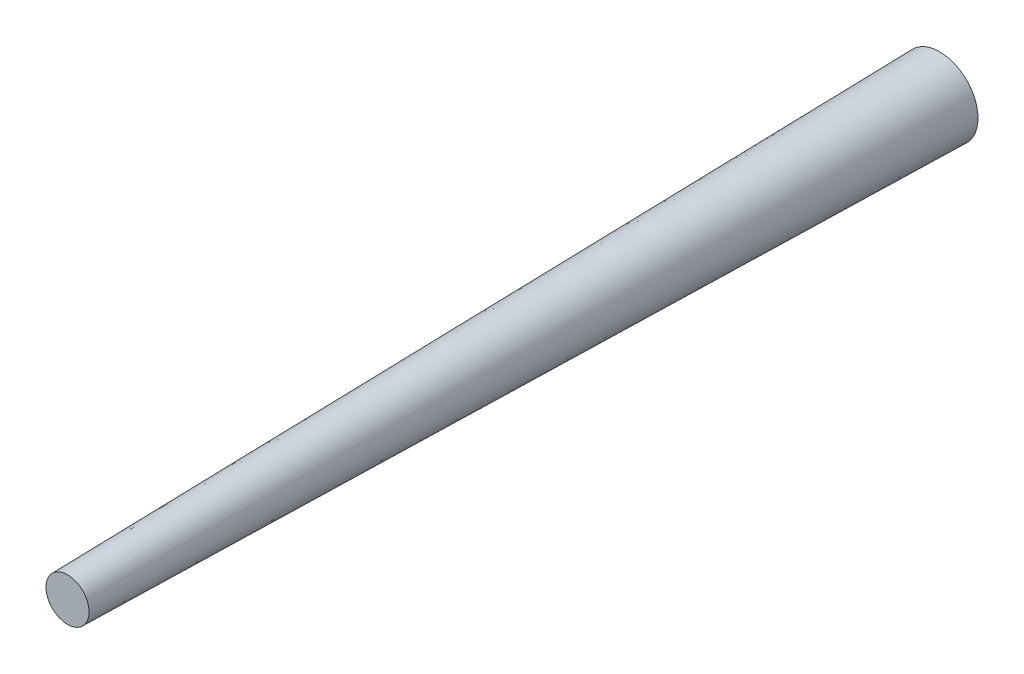
ISO-10303-21;
HEADER;
FILE_DESCRIPTION(('STEP AP214'),'2;1');
FILE_NAME('part.step','',(''),(''),'','','');
FILE_SCHEMA(('AUTOMOTIVE_DESIGN { 1 0 10303 214 1 1 1 1 }'));
ENDSEC;
DATA;
#1=APPLICATION_CONTEXT('core data for automotive mechanical design processes');
#2=APPLICATION_PROTOCOL_DEFINITION('international standard','automotive_design',2000,#1);
#3=PRODUCT_CONTEXT('',#1,'mechanical');
#4=PRODUCT('Part','Part','',(#3));
#5=PRODUCT_RELATED_PRODUCT_CATEGORY('part','',(#4));
#6=PRODUCT_DEFINITION_FORMATION('','',#4);
#7=PRODUCT_DEFINITION_CONTEXT('part definition',#1,'design');
#8=PRODUCT_DEFINITION('design','',#6,#7);
#9=PRODUCT_DEFINITION_SHAPE('','',#8);
#10=(LENGTH_UNIT() NAMED_UNIT(*) SI_UNIT(.MILLI.,.METRE.));
#11=(NAMED_UNIT(*) PLANE_ANGLE_UNIT() SI_UNIT($,.RADIAN.));
#12=(NAMED_UNIT(*) SI_UNIT($,.STERADIAN.) SOLID_ANGLE_UNIT());
#13=UNCERTAINTY_MEASURE_WITH_UNIT(LENGTH_MEASURE(1.E-05),#10,'distance_accuracy_value','');
#14=(GEOMETRIC_REPRESENTATION_CONTEXT(3) GLOBAL_UNCERTAINTY_ASSIGNED_CONTEXT((#13)) GLOBAL_UNIT_ASSIGNED_CONTEXT((#10,
#11,#12)) REPRESENTATION_CONTEXT('',''));
#15=CARTESIAN_POINT('',(0.,0.,0.));
#16=DIRECTION('',(0.,0.,1.));
#17=DIRECTION('',(1.,0.,0.));
#18=AXIS2_PLACEMENT_3D('',#15,#16,#17);
#19=CARTESIAN_POINT('',(0.,0.,1024.69227611953));
#20=DIRECTION('',(0.,0.,-1.));
#21=DIRECTION('',(-1.,0.,0.));
#22=AXIS2_PLACEMENT_3D('',#19,#20,#21);
#23=CONICAL_SURFACE('',#22,15.19139674175,0.0191986217719376);
#24=CARTESIAN_POINT('',(0.,0.,409.692276119534));
#25=DIRECTION('',(0.,0.,1.));
#26=DIRECTION('',(1.,0.,0.));
#27=AXIS2_PLACEMENT_3D('',#24,#25,#26);
#28=CIRCLE('',#27,27.);
#29=CARTESIAN_POINT('',(27.,0.,409.692276119534));
#30=VERTEX_POINT('',#29);
#31=EDGE_CURVE('E10',#30,#30,#28,.T.);
#32=ORIENTED_EDGE('',*,*,#31,.T.);
#33=EDGE_LOOP('',(#32));
#34=FACE_BOUND('',#33,.T.);
#35=CARTESIAN_POINT('',(0.,0.,1024.69227611953));
#36=DIRECTION('',(0.,0.,1.));
#37=DIRECTION('',(1.,0.,0.));
#38=AXIS2_PLACEMENT_3D('',#35,#36,#37);
#39=CIRCLE('',#38,15.19139674175);
#40=CARTESIAN_POINT('',(15.19139674175,0.,1024.69227611953));
#41=VERTEX_POINT('',#40);
#42=EDGE_CURVE('E34',#41,#41,#39,.T.);
#43=ORIENTED_EDGE('',*,*,#42,.F.);
#44=EDGE_LOOP('',(#43));
#45=FACE_BOUND('',#44,.T.);
#46=ADVANCED_FACE('F28',(#34,#45),#23,.T.);
#47=CARTESIAN_POINT('',(27.,0.,409.692276119534));
#48=DIRECTION('',(0.,0.,-1.));
#49=DIRECTION('',(-1.,0.,0.));
#50=AXIS2_PLACEMENT_3D('',#47,#48,#49);
#51=PLANE('',#50);
#52=ORIENTED_EDGE('',*,*,#31,.F.);
#53=EDGE_LOOP('',(#52));
#54=FACE_BOUND('',#53,.T.);
#55=ADVANCED_FACE('F43',(#54),#51,.T.);
#56=CARTESIAN_POINT('',(0.,0.,1024.69227611953));
#57=DIRECTION('',(0.,0.,1.));
#58=DIRECTION('',(1.,0.,0.));
#59=AXIS2_PLACEMENT_3D('',#56,#57,#58);
#60=PLANE('',#59);
#61=ORIENTED_EDGE('',*,*,#42,.T.);
#62=EDGE_LOOP('',(#61));
#63=FACE_BOUND('',#62,.T.);
#64=ADVANCED_FACE('F40',(#63),#60,.T.);
#65=CLOSED_SHELL('',(#46,#55,#64));
#66=MANIFOLD_SOLID_BREP('B2',#65);
#67=ADVANCED_BREP_SHAPE_REPRESENTATION('',(#18,#66),#14);
#68=SHAPE_DEFINITION_REPRESENTATION(#9,#67);
ENDSEC;
END-ISO-10303-21;
